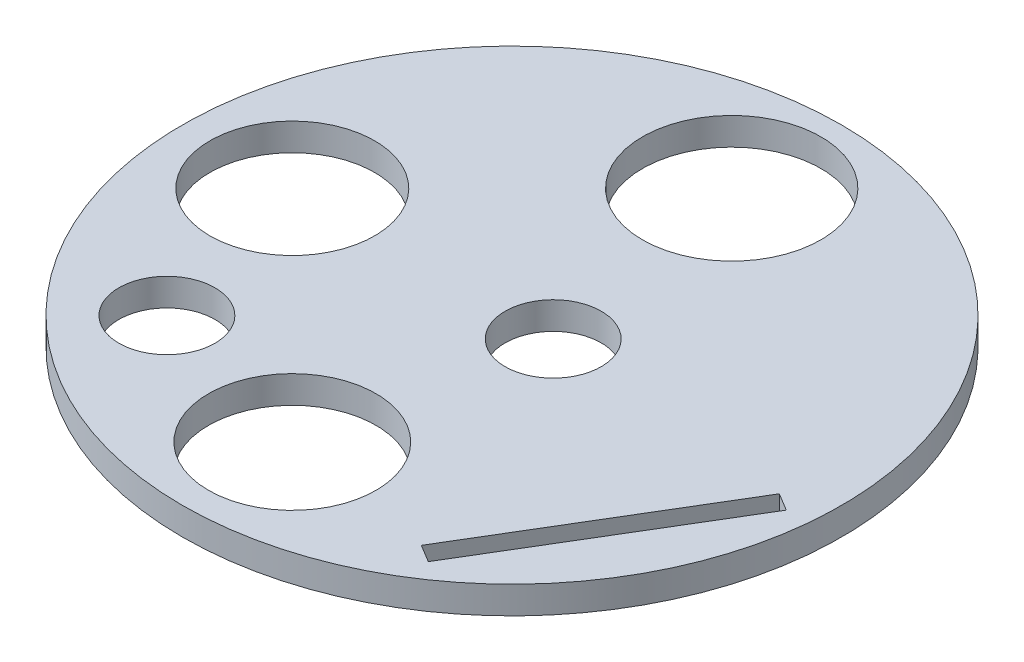
ISO-10303-21;
HEADER;
FILE_DESCRIPTION(('STEP AP214'),'2;1');
FILE_NAME('part.step','',(''),(''),'','','');
FILE_SCHEMA(('AUTOMOTIVE_DESIGN { 1 0 10303 214 1 1 1 1 }'));
ENDSEC;
DATA;
#1=APPLICATION_CONTEXT('core data for automotive mechanical design processes');
#2=APPLICATION_PROTOCOL_DEFINITION('international standard','automotive_design',2000,#1);
#3=PRODUCT_CONTEXT('',#1,'mechanical');
#4=PRODUCT('Part','Part','',(#3));
#5=PRODUCT_RELATED_PRODUCT_CATEGORY('part','',(#4));
#6=PRODUCT_DEFINITION_FORMATION('','',#4);
#7=PRODUCT_DEFINITION_CONTEXT('part definition',#1,'design');
#8=PRODUCT_DEFINITION('design','',#6,#7);
#9=PRODUCT_DEFINITION_SHAPE('','',#8);
#10=(LENGTH_UNIT() NAMED_UNIT(*) SI_UNIT(.MILLI.,.METRE.));
#11=(NAMED_UNIT(*) PLANE_ANGLE_UNIT() SI_UNIT($,.RADIAN.));
#12=(NAMED_UNIT(*) SI_UNIT($,.STERADIAN.) SOLID_ANGLE_UNIT());
#13=UNCERTAINTY_MEASURE_WITH_UNIT(LENGTH_MEASURE(1.E-05),#10,'distance_accuracy_value','');
#14=(GEOMETRIC_REPRESENTATION_CONTEXT(3) GLOBAL_UNCERTAINTY_ASSIGNED_CONTEXT((#13)) GLOBAL_UNIT_ASSIGNED_CONTEXT((#10,
#11,#12)) REPRESENTATION_CONTEXT('',''));
#15=CARTESIAN_POINT('',(0.,0.,0.));
#16=DIRECTION('',(0.,0.,1.));
#17=DIRECTION('',(1.,0.,0.));
#18=AXIS2_PLACEMENT_3D('',#15,#16,#17);
#19=CARTESIAN_POINT('',(0.,2.,0.));
#20=DIRECTION('',(0.,1.,0.));
#21=DIRECTION('',(0.,0.,1.));
#22=AXIS2_PLACEMENT_3D('',#19,#20,#21);
#23=PLANE('',#22);
#24=CARTESIAN_POINT('',(-12.5429192291393,2.,12.5864078209969));
#25=DIRECTION('',(0.,1.,0.));
#26=DIRECTION('',(0.,0.,1.));
#27=AXIS2_PLACEMENT_3D('',#24,#25,#26);
#28=CIRCLE('',#27,3.5);
#29=CARTESIAN_POINT('',(-12.5429192291393,2.,16.0864078209969));
#30=VERTEX_POINT('',#29);
#31=EDGE_CURVE('E116',#30,#30,#28,.T.);
#32=ORIENTED_EDGE('',*,*,#31,.F.);
#33=EDGE_LOOP('',(#32));
#34=FACE_BOUND('',#33,.T.);
#35=CARTESIAN_POINT('',(-16.,2.,0.));
#36=DIRECTION('',(0.,1.,0.));
#37=DIRECTION('',(0.,0.,1.));
#38=AXIS2_PLACEMENT_3D('',#35,#36,#37);
#39=CIRCLE('',#38,6.00000000000001);
#40=CARTESIAN_POINT('',(-16.,2.,6.00000000000001));
#41=VERTEX_POINT('',#40);
#42=EDGE_CURVE('E140',#41,#41,#39,.T.);
#43=ORIENTED_EDGE('',*,*,#42,.F.);
#44=EDGE_LOOP('',(#43));
#45=FACE_BOUND('',#44,.T.);
#46=CARTESIAN_POINT('',(0.,2.,0.));
#47=DIRECTION('',(0.,1.,0.));
#48=DIRECTION('',(0.,0.,1.));
#49=AXIS2_PLACEMENT_3D('',#46,#47,#48);
#50=CIRCLE('',#49,24.);
#51=CARTESIAN_POINT('',(0.,2.,24.));
#52=VERTEX_POINT('',#51);
#53=EDGE_CURVE('E11',#52,#52,#50,.T.);
#54=ORIENTED_EDGE('',*,*,#53,.T.);
#55=EDGE_LOOP('',(#54));
#56=FACE_BOUND('',#55,.T.);
#57=CARTESIAN_POINT('',(0.,2.,-16.));
#58=DIRECTION('',(0.,1.,0.));
#59=DIRECTION('',(0.,0.,1.));
#60=AXIS2_PLACEMENT_3D('',#57,#58,#59);
#61=CIRCLE('',#60,6.5);
#62=CARTESIAN_POINT('',(0.,2.,-9.5));
#63=VERTEX_POINT('',#62);
#64=EDGE_CURVE('E148',#63,#63,#61,.T.);
#65=ORIENTED_EDGE('',*,*,#64,.F.);
#66=EDGE_LOOP('',(#65));
#67=FACE_BOUND('',#66,.T.);
#68=CARTESIAN_POINT('',(0.,2.,16.));
#69=DIRECTION('',(0.,1.,0.));
#70=DIRECTION('',(0.,0.,1.));
#71=AXIS2_PLACEMENT_3D('',#68,#69,#70);
#72=CIRCLE('',#71,6.1);
#73=CARTESIAN_POINT('',(0.,2.,22.1));
#74=VERTEX_POINT('',#73);
#75=EDGE_CURVE('E132',#74,#74,#72,.T.);
#76=ORIENTED_EDGE('',*,*,#75,.F.);
#77=EDGE_LOOP('',(#76));
#78=FACE_BOUND('',#77,.T.);
#79=DIRECTION('',(-0.515038074910058,0.,0.85716730070211));
#80=VECTOR('',#79,1.);
#81=CARTESIAN_POINT('',(21.,2.,1.53505572603321));
#82=LINE('',#81,#80);
#83=CARTESIAN_POINT('',(21.,2.,1.53505572603321));
#84=VERTEX_POINT('',#83);
#85=CARTESIAN_POINT('',(11.2142765767089,2.,17.8212344393733));
#86=VERTEX_POINT('',#85);
#87=EDGE_CURVE('E90',#84,#86,#82,.T.);
#88=ORIENTED_EDGE('',*,*,#87,.F.);
#89=DIRECTION('',(-0.85716730070211,0.,-0.515038074910058));
#90=VECTOR('',#89,1.);
#91=CARTESIAN_POINT('',(22.2857509510532,2.,2.3076128383983));
#92=LINE('',#91,#90);
#93=CARTESIAN_POINT('',(22.2857509510532,2.,2.3076128383983));
#94=VERTEX_POINT('',#93);
#95=EDGE_CURVE('E81',#94,#84,#92,.T.);
#96=ORIENTED_EDGE('',*,*,#95,.F.);
#97=DIRECTION('',(0.515038074910058,0.,-0.85716730070211));
#98=VECTOR('',#97,1.);
#99=CARTESIAN_POINT('',(12.5000275277621,2.,18.5937915517384));
#100=LINE('',#99,#98);
#101=CARTESIAN_POINT('',(12.5000275277621,2.,18.5937915517384));
#102=VERTEX_POINT('',#101);
#103=EDGE_CURVE('E108',#102,#94,#100,.T.);
#104=ORIENTED_EDGE('',*,*,#103,.F.);
#105=DIRECTION('',(0.85716730070211,0.,0.515038074910057));
#106=VECTOR('',#105,1.);
#107=CARTESIAN_POINT('',(11.2142765767089,2.,17.8212344393733));
#108=LINE('',#107,#106);
#109=EDGE_CURVE('E104',#86,#102,#108,.T.);
#110=ORIENTED_EDGE('',*,*,#109,.F.);
#111=EDGE_LOOP('',(#88,#96,#104,#110));
#112=FACE_BOUND('',#111,.T.);
#113=CARTESIAN_POINT('',(3.,2.,0.));
#114=DIRECTION('',(0.,1.,0.));
#115=DIRECTION('',(0.,0.,1.));
#116=AXIS2_PLACEMENT_3D('',#113,#114,#115);
#117=CIRCLE('',#116,3.5);
#118=CARTESIAN_POINT('',(3.,2.,3.5));
#119=VERTEX_POINT('',#118);
#120=EDGE_CURVE('E223',#119,#119,#117,.T.);
#121=ORIENTED_EDGE('',*,*,#120,.F.);
#122=EDGE_LOOP('',(#121));
#123=FACE_BOUND('',#122,.T.);
#124=ADVANCED_FACE('F39',(#34,#45,#56,#67,#78,#112,#123),#23,.T.);
#125=CARTESIAN_POINT('',(0.,0.,0.));
#126=DIRECTION('',(0.,1.,0.));
#127=DIRECTION('',(0.,0.,1.));
#128=AXIS2_PLACEMENT_3D('',#125,#126,#127);
#129=PLANE('',#128);
#130=CARTESIAN_POINT('',(0.,0.,16.));
#131=DIRECTION('',(0.,1.,0.));
#132=DIRECTION('',(0.,0.,1.));
#133=AXIS2_PLACEMENT_3D('',#130,#131,#132);
#134=CIRCLE('',#133,6.1);
#135=CARTESIAN_POINT('',(0.,0.,22.1));
#136=VERTEX_POINT('',#135);
#137=EDGE_CURVE('E99',#136,#136,#134,.T.);
#138=ORIENTED_EDGE('',*,*,#137,.T.);
#139=EDGE_LOOP('',(#138));
#140=FACE_BOUND('',#139,.T.);
#141=CARTESIAN_POINT('',(-16.,0.,0.));
#142=DIRECTION('',(0.,1.,0.));
#143=DIRECTION('',(0.,0.,1.));
#144=AXIS2_PLACEMENT_3D('',#141,#142,#143);
#145=CIRCLE('',#144,6.00000000000001);
#146=CARTESIAN_POINT('',(-16.,0.,6.00000000000001));
#147=VERTEX_POINT('',#146);
#148=EDGE_CURVE('E136',#147,#147,#145,.T.);
#149=ORIENTED_EDGE('',*,*,#148,.T.);
#150=EDGE_LOOP('',(#149));
#151=FACE_BOUND('',#150,.T.);
#152=CARTESIAN_POINT('',(0.,0.,-16.));
#153=DIRECTION('',(0.,1.,0.));
#154=DIRECTION('',(0.,0.,1.));
#155=AXIS2_PLACEMENT_3D('',#152,#153,#154);
#156=CIRCLE('',#155,6.5);
#157=CARTESIAN_POINT('',(0.,0.,-9.5));
#158=VERTEX_POINT('',#157);
#159=EDGE_CURVE('E144',#158,#158,#156,.T.);
#160=ORIENTED_EDGE('',*,*,#159,.T.);
#161=EDGE_LOOP('',(#160));
#162=FACE_BOUND('',#161,.T.);
#163=CARTESIAN_POINT('',(0.,0.,0.));
#164=DIRECTION('',(0.,1.,0.));
#165=DIRECTION('',(0.,0.,1.));
#166=AXIS2_PLACEMENT_3D('',#163,#164,#165);
#167=CIRCLE('',#166,24.);
#168=CARTESIAN_POINT('',(0.,0.,24.));
#169=VERTEX_POINT('',#168);
#170=EDGE_CURVE('E43',#169,#169,#167,.T.);
#171=ORIENTED_EDGE('',*,*,#170,.F.);
#172=EDGE_LOOP('',(#171));
#173=FACE_BOUND('',#172,.T.);
#174=DIRECTION('',(-0.85716730070211,0.,-0.515038074910058));
#175=VECTOR('',#174,1.);
#176=CARTESIAN_POINT('',(22.2857509510532,0.,2.3076128383983));
#177=LINE('',#176,#175);
#178=CARTESIAN_POINT('',(22.2857509510532,0.,2.3076128383983));
#179=VERTEX_POINT('',#178);
#180=CARTESIAN_POINT('',(21.,0.,1.53505572603321));
#181=VERTEX_POINT('',#180);
#182=EDGE_CURVE('E63',#179,#181,#177,.T.);
#183=ORIENTED_EDGE('',*,*,#182,.T.);
#184=DIRECTION('',(-0.515038074910058,0.,0.85716730070211));
#185=VECTOR('',#184,1.);
#186=CARTESIAN_POINT('',(21.,0.,1.53505572603321));
#187=LINE('',#186,#185);
#188=CARTESIAN_POINT('',(11.2142765767089,0.,17.8212344393733));
#189=VERTEX_POINT('',#188);
#190=EDGE_CURVE('E97',#181,#189,#187,.T.);
#191=ORIENTED_EDGE('',*,*,#190,.T.);
#192=DIRECTION('',(0.85716730070211,0.,0.515038074910057));
#193=VECTOR('',#192,1.);
#194=CARTESIAN_POINT('',(11.2142765767089,0.,17.8212344393733));
#195=LINE('',#194,#193);
#196=CARTESIAN_POINT('',(12.5000275277621,0.,18.5937915517384));
#197=VERTEX_POINT('',#196);
#198=EDGE_CURVE('E119',#189,#197,#195,.T.);
#199=ORIENTED_EDGE('',*,*,#198,.T.);
#200=DIRECTION('',(0.515038074910058,0.,-0.85716730070211));
#201=VECTOR('',#200,1.);
#202=CARTESIAN_POINT('',(12.5000275277621,0.,18.5937915517384));
#203=LINE('',#202,#201);
#204=EDGE_CURVE('E91',#197,#179,#203,.T.);
#205=ORIENTED_EDGE('',*,*,#204,.T.);
#206=EDGE_LOOP('',(#183,#191,#199,#205));
#207=FACE_BOUND('',#206,.T.);
#208=CARTESIAN_POINT('',(-12.5429192291393,0.,12.5864078209969));
#209=DIRECTION('',(0.,1.,0.));
#210=DIRECTION('',(0.,0.,1.));
#211=AXIS2_PLACEMENT_3D('',#208,#209,#210);
#212=CIRCLE('',#211,3.5);
#213=CARTESIAN_POINT('',(-12.5429192291393,0.,16.0864078209969));
#214=VERTEX_POINT('',#213);
#215=EDGE_CURVE('E231',#214,#214,#212,.T.);
#216=ORIENTED_EDGE('',*,*,#215,.T.);
#217=EDGE_LOOP('',(#216));
#218=FACE_BOUND('',#217,.T.);
#219=CARTESIAN_POINT('',(3.,0.,0.));
#220=DIRECTION('',(0.,1.,0.));
#221=DIRECTION('',(0.,0.,1.));
#222=AXIS2_PLACEMENT_3D('',#219,#220,#221);
#223=CIRCLE('',#222,3.5);
#224=CARTESIAN_POINT('',(3.,0.,3.5));
#225=VERTEX_POINT('',#224);
#226=EDGE_CURVE('E226',#225,#225,#223,.T.);
#227=ORIENTED_EDGE('',*,*,#226,.T.);
#228=EDGE_LOOP('',(#227));
#229=FACE_BOUND('',#228,.T.);
#230=ADVANCED_FACE('F156',(#140,#151,#162,#173,#207,#218,#229),#129,.F.);
#231=CARTESIAN_POINT('',(0.,2.,0.));
#232=DIRECTION('',(0.,-1.,0.));
#233=DIRECTION('',(0.,0.,-1.));
#234=AXIS2_PLACEMENT_3D('',#231,#232,#233);
#235=CYLINDRICAL_SURFACE('',#234,24.);
#236=ORIENTED_EDGE('',*,*,#53,.F.);
#237=EDGE_LOOP('',(#236));
#238=FACE_BOUND('',#237,.T.);
#239=ORIENTED_EDGE('',*,*,#170,.T.);
#240=EDGE_LOOP('',(#239));
#241=FACE_BOUND('',#240,.T.);
#242=ADVANCED_FACE('F41',(#238,#241),#235,.T.);
#243=CARTESIAN_POINT('',(0.,2.,-16.));
#244=DIRECTION('',(0.,-1.,0.));
#245=DIRECTION('',(0.,0.,-1.));
#246=AXIS2_PLACEMENT_3D('',#243,#244,#245);
#247=CYLINDRICAL_SURFACE('',#246,6.5);
#248=ORIENTED_EDGE('',*,*,#64,.T.);
#249=EDGE_LOOP('',(#248));
#250=FACE_BOUND('',#249,.T.);
#251=ORIENTED_EDGE('',*,*,#159,.F.);
#252=EDGE_LOOP('',(#251));
#253=FACE_BOUND('',#252,.T.);
#254=ADVANCED_FACE('F159',(#250,#253),#247,.F.);
#255=CARTESIAN_POINT('',(-16.,2.,0.));
#256=DIRECTION('',(0.,-1.,0.));
#257=DIRECTION('',(0.,0.,-1.));
#258=AXIS2_PLACEMENT_3D('',#255,#256,#257);
#259=CYLINDRICAL_SURFACE('',#258,6.00000000000001);
#260=ORIENTED_EDGE('',*,*,#42,.T.);
#261=EDGE_LOOP('',(#260));
#262=FACE_BOUND('',#261,.T.);
#263=ORIENTED_EDGE('',*,*,#148,.F.);
#264=EDGE_LOOP('',(#263));
#265=FACE_BOUND('',#264,.T.);
#266=ADVANCED_FACE('F161',(#262,#265),#259,.F.);
#267=CARTESIAN_POINT('',(0.,2.,16.));
#268=DIRECTION('',(0.,-1.,0.));
#269=DIRECTION('',(0.,0.,-1.));
#270=AXIS2_PLACEMENT_3D('',#267,#268,#269);
#271=CYLINDRICAL_SURFACE('',#270,6.1);
#272=ORIENTED_EDGE('',*,*,#75,.T.);
#273=EDGE_LOOP('',(#272));
#274=FACE_BOUND('',#273,.T.);
#275=ORIENTED_EDGE('',*,*,#137,.F.);
#276=EDGE_LOOP('',(#275));
#277=FACE_BOUND('',#276,.T.);
#278=ADVANCED_FACE('F168',(#274,#277),#271,.F.);
#279=CARTESIAN_POINT('',(22.2857509510532,2.,2.3076128383983));
#280=DIRECTION('',(-0.515038074910058,0.,0.85716730070211));
#281=DIRECTION('',(0.85716730070211,0.,0.515038074910058));
#282=AXIS2_PLACEMENT_3D('',#279,#280,#281);
#283=PLANE('',#282);
#284=ORIENTED_EDGE('',*,*,#182,.F.);
#285=DIRECTION('',(0.,-1.,0.));
#286=VECTOR('',#285,1.);
#287=CARTESIAN_POINT('',(22.2857509510532,2.,2.3076128383983));
#288=LINE('',#287,#286);
#289=EDGE_CURVE('E85',#94,#179,#288,.T.);
#290=ORIENTED_EDGE('',*,*,#289,.F.);
#291=ORIENTED_EDGE('',*,*,#95,.T.);
#292=DIRECTION('',(0.,-1.,0.));
#293=VECTOR('',#292,1.);
#294=CARTESIAN_POINT('',(21.,2.,1.53505572603321));
#295=LINE('',#294,#293);
#296=EDGE_CURVE('E84',#84,#181,#295,.T.);
#297=ORIENTED_EDGE('',*,*,#296,.T.);
#298=EDGE_LOOP('',(#284,#290,#291,#297));
#299=FACE_BOUND('',#298,.T.);
#300=ADVANCED_FACE('F83',(#299),#283,.T.);
#301=CARTESIAN_POINT('',(21.,2.,1.53505572603321));
#302=DIRECTION('',(0.85716730070211,0.,0.515038074910058));
#303=DIRECTION('',(0.515038074910058,0.,-0.85716730070211));
#304=AXIS2_PLACEMENT_3D('',#301,#302,#303);
#305=PLANE('',#304);
#306=ORIENTED_EDGE('',*,*,#190,.F.);
#307=ORIENTED_EDGE('',*,*,#296,.F.);
#308=ORIENTED_EDGE('',*,*,#87,.T.);
#309=DIRECTION('',(0.,-1.,0.));
#310=VECTOR('',#309,1.);
#311=CARTESIAN_POINT('',(11.2142765767089,2.,17.8212344393733));
#312=LINE('',#311,#310);
#313=EDGE_CURVE('E100',#86,#189,#312,.T.);
#314=ORIENTED_EDGE('',*,*,#313,.T.);
#315=EDGE_LOOP('',(#306,#307,#308,#314));
#316=FACE_BOUND('',#315,.T.);
#317=ADVANCED_FACE('F94',(#316),#305,.T.);
#318=CARTESIAN_POINT('',(11.2142765767089,2.,17.8212344393733));
#319=DIRECTION('',(0.515038074910057,0.,-0.85716730070211));
#320=DIRECTION('',(-0.85716730070211,0.,-0.515038074910057));
#321=AXIS2_PLACEMENT_3D('',#318,#319,#320);
#322=PLANE('',#321);
#323=ORIENTED_EDGE('',*,*,#198,.F.);
#324=ORIENTED_EDGE('',*,*,#313,.F.);
#325=ORIENTED_EDGE('',*,*,#109,.T.);
#326=DIRECTION('',(0.,-1.,0.));
#327=VECTOR('',#326,1.);
#328=CARTESIAN_POINT('',(12.5000275277621,2.,18.5937915517384));
#329=LINE('',#328,#327);
#330=EDGE_CURVE('E55',#102,#197,#329,.T.);
#331=ORIENTED_EDGE('',*,*,#330,.T.);
#332=EDGE_LOOP('',(#323,#324,#325,#331));
#333=FACE_BOUND('',#332,.T.);
#334=ADVANCED_FACE('F204',(#333),#322,.T.);
#335=CARTESIAN_POINT('',(12.5000275277621,2.,18.5937915517384));
#336=DIRECTION('',(-0.85716730070211,0.,-0.515038074910058));
#337=DIRECTION('',(-0.515038074910058,0.,0.85716730070211));
#338=AXIS2_PLACEMENT_3D('',#335,#336,#337);
#339=PLANE('',#338);
#340=ORIENTED_EDGE('',*,*,#204,.F.);
#341=ORIENTED_EDGE('',*,*,#330,.F.);
#342=ORIENTED_EDGE('',*,*,#103,.T.);
#343=ORIENTED_EDGE('',*,*,#289,.T.);
#344=EDGE_LOOP('',(#340,#341,#342,#343));
#345=FACE_BOUND('',#344,.T.);
#346=ADVANCED_FACE('F207',(#345),#339,.T.);
#347=CARTESIAN_POINT('',(-12.5429192291393,2.,12.5864078209969));
#348=DIRECTION('',(0.,-1.,0.));
#349=DIRECTION('',(0.,0.,-1.));
#350=AXIS2_PLACEMENT_3D('',#347,#348,#349);
#351=CYLINDRICAL_SURFACE('',#350,3.5);
#352=ORIENTED_EDGE('',*,*,#31,.T.);
#353=EDGE_LOOP('',(#352));
#354=FACE_BOUND('',#353,.T.);
#355=ORIENTED_EDGE('',*,*,#215,.F.);
#356=EDGE_LOOP('',(#355));
#357=FACE_BOUND('',#356,.T.);
#358=ADVANCED_FACE('F211',(#354,#357),#351,.F.);
#359=CARTESIAN_POINT('',(3.,2.,0.));
#360=DIRECTION('',(0.,-1.,0.));
#361=DIRECTION('',(0.,0.,-1.));
#362=AXIS2_PLACEMENT_3D('',#359,#360,#361);
#363=CYLINDRICAL_SURFACE('',#362,3.5);
#364=ORIENTED_EDGE('',*,*,#120,.T.);
#365=EDGE_LOOP('',(#364));
#366=FACE_BOUND('',#365,.T.);
#367=ORIENTED_EDGE('',*,*,#226,.F.);
#368=EDGE_LOOP('',(#367));
#369=FACE_BOUND('',#368,.T.);
#370=ADVANCED_FACE('F214',(#366,#369),#363,.F.);
#371=CLOSED_SHELL('',(#124,#230,#242,#254,#266,#278,#300,#317,#334,#346,#358,#370));
#372=MANIFOLD_SOLID_BREP('B2',#371);
#373=ADVANCED_BREP_SHAPE_REPRESENTATION('',(#18,#372),#14);
#374=SHAPE_DEFINITION_REPRESENTATION(#9,#373);
ENDSEC;
END-ISO-10303-21;
